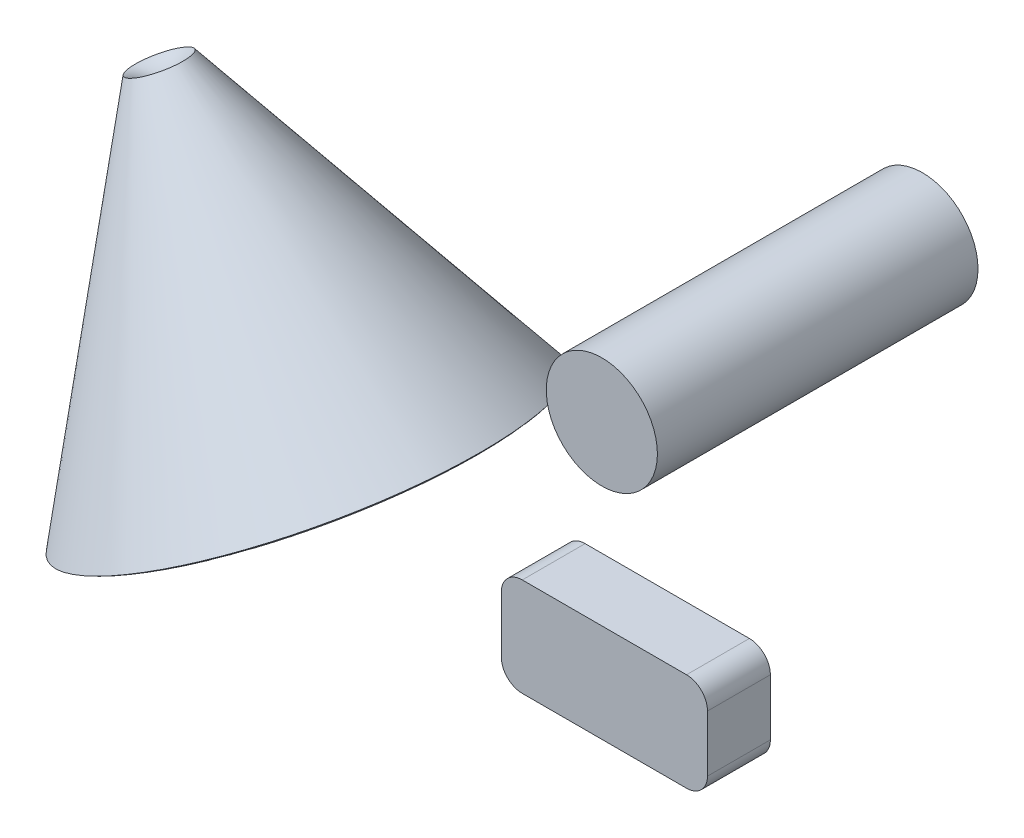
ISO-10303-21;
HEADER;
FILE_DESCRIPTION(('STEP AP214'),'2;1');
FILE_NAME('part.step','',(''),(''),'','','');
FILE_SCHEMA(('AUTOMOTIVE_DESIGN { 1 0 10303 214 1 1 1 1 }'));
ENDSEC;
DATA;
#1=APPLICATION_CONTEXT('core data for automotive mechanical design processes');
#2=APPLICATION_PROTOCOL_DEFINITION('international standard','automotive_design',2000,#1);
#3=PRODUCT_CONTEXT('',#1,'mechanical');
#4=PRODUCT('Part','Part','',(#3));
#5=PRODUCT_RELATED_PRODUCT_CATEGORY('part','',(#4));
#6=PRODUCT_DEFINITION_FORMATION('','',#4);
#7=PRODUCT_DEFINITION_CONTEXT('part definition',#1,'design');
#8=PRODUCT_DEFINITION('design','',#6,#7);
#9=PRODUCT_DEFINITION_SHAPE('','',#8);
#10=(LENGTH_UNIT() NAMED_UNIT(*) SI_UNIT(.MILLI.,.METRE.));
#11=(NAMED_UNIT(*) PLANE_ANGLE_UNIT() SI_UNIT($,.RADIAN.));
#12=(NAMED_UNIT(*) SI_UNIT($,.STERADIAN.) SOLID_ANGLE_UNIT());
#13=UNCERTAINTY_MEASURE_WITH_UNIT(LENGTH_MEASURE(1.E-05),#10,'distance_accuracy_value','');
#14=(GEOMETRIC_REPRESENTATION_CONTEXT(3) GLOBAL_UNCERTAINTY_ASSIGNED_CONTEXT((#13)) GLOBAL_UNIT_ASSIGNED_CONTEXT((#10,
#11,#12)) REPRESENTATION_CONTEXT('',''));
#15=CARTESIAN_POINT('',(0.,0.,0.));
#16=DIRECTION('',(0.,0.,1.));
#17=DIRECTION('',(1.,0.,0.));
#18=AXIS2_PLACEMENT_3D('',#15,#16,#17);
#19=CARTESIAN_POINT('',(394.330774186837,124.883495853498,30.));
#20=DIRECTION('',(0.,0.,-1.));
#21=DIRECTION('',(-1.,0.,0.));
#22=AXIS2_PLACEMENT_3D('',#19,#20,#21);
#23=CYLINDRICAL_SURFACE('',#22,10.);
#24=CARTESIAN_POINT('',(394.330774186837,124.883495853498,0.));
#25=DIRECTION('',(0.,0.,1.));
#26=DIRECTION('',(1.,0.,0.));
#27=AXIS2_PLACEMENT_3D('',#24,#25,#26);
#28=CIRCLE('',#27,10.);
#29=CARTESIAN_POINT('',(384.330774186837,124.883495853498,0.));
#30=VERTEX_POINT('',#29);
#31=CARTESIAN_POINT('',(394.330774186837,114.883495853498,0.));
#32=VERTEX_POINT('',#31);
#33=EDGE_CURVE('E145',#30,#32,#28,.T.);
#34=ORIENTED_EDGE('',*,*,#33,.T.);
#35=DIRECTION('',(0.,0.,-1.));
#36=VECTOR('',#35,1.);
#37=CARTESIAN_POINT('',(394.330774186837,114.883495853498,30.));
#38=LINE('',#37,#36);
#39=CARTESIAN_POINT('',(394.330774186837,114.883495853498,30.));
#40=VERTEX_POINT('',#39);
#41=EDGE_CURVE('E12',#40,#32,#38,.T.);
#42=ORIENTED_EDGE('',*,*,#41,.F.);
#43=CARTESIAN_POINT('',(394.330774186837,124.883495853498,30.));
#44=DIRECTION('',(0.,0.,1.));
#45=DIRECTION('',(1.,0.,0.));
#46=AXIS2_PLACEMENT_3D('',#43,#44,#45);
#47=CIRCLE('',#46,10.);
#48=CARTESIAN_POINT('',(384.330774186837,124.883495853498,30.));
#49=VERTEX_POINT('',#48);
#50=EDGE_CURVE('E158',#49,#40,#47,.T.);
#51=ORIENTED_EDGE('',*,*,#50,.F.);
#52=DIRECTION('',(0.,0.,-1.));
#53=VECTOR('',#52,1.);
#54=CARTESIAN_POINT('',(384.330774186837,124.883495853498,30.));
#55=LINE('',#54,#53);
#56=EDGE_CURVE('E136',#49,#30,#55,.T.);
#57=ORIENTED_EDGE('',*,*,#56,.T.);
#58=EDGE_LOOP('',(#34,#42,#51,#57));
#59=FACE_BOUND('',#58,.T.);
#60=ADVANCED_FACE('F48',(#59),#23,.T.);
#61=CARTESIAN_POINT('',(394.330774186837,114.883495853498,30.));
#62=DIRECTION('',(0.,1.,0.));
#63=DIRECTION('',(0.,0.,1.));
#64=AXIS2_PLACEMENT_3D('',#61,#62,#63);
#65=PLANE('',#64);
#66=DIRECTION('',(1.,0.,0.));
#67=VECTOR('',#66,1.);
#68=CARTESIAN_POINT('',(394.330774186837,114.883495853498,0.));
#69=LINE('',#68,#67);
#70=CARTESIAN_POINT('',(472.718965476247,114.883495853498,0.));
#71=VERTEX_POINT('',#70);
#72=EDGE_CURVE('E150',#32,#71,#69,.T.);
#73=ORIENTED_EDGE('',*,*,#72,.T.);
#74=DIRECTION('',(0.,0.,-1.));
#75=VECTOR('',#74,1.);
#76=CARTESIAN_POINT('',(472.718965476247,114.883495853498,30.));
#77=LINE('',#76,#75);
#78=CARTESIAN_POINT('',(472.718965476247,114.883495853498,30.));
#79=VERTEX_POINT('',#78);
#80=EDGE_CURVE('E57',#79,#71,#77,.T.);
#81=ORIENTED_EDGE('',*,*,#80,.F.);
#82=DIRECTION('',(1.,0.,0.));
#83=VECTOR('',#82,1.);
#84=CARTESIAN_POINT('',(394.330774186837,114.883495853498,30.));
#85=LINE('',#84,#83);
#86=EDGE_CURVE('E110',#40,#79,#85,.T.);
#87=ORIENTED_EDGE('',*,*,#86,.F.);
#88=ORIENTED_EDGE('',*,*,#41,.T.);
#89=EDGE_LOOP('',(#73,#81,#87,#88));
#90=FACE_BOUND('',#89,.T.);
#91=ADVANCED_FACE('F192',(#90),#65,.F.);
#92=CARTESIAN_POINT('',(472.718965476247,124.883495853498,30.));
#93=DIRECTION('',(0.,0.,-1.));
#94=DIRECTION('',(-1.,0.,0.));
#95=AXIS2_PLACEMENT_3D('',#92,#93,#94);
#96=CYLINDRICAL_SURFACE('',#95,10.);
#97=CARTESIAN_POINT('',(472.718965476247,124.883495853498,0.));
#98=DIRECTION('',(0.,0.,1.));
#99=DIRECTION('',(1.,0.,0.));
#100=AXIS2_PLACEMENT_3D('',#97,#98,#99);
#101=CIRCLE('',#100,10.);
#102=CARTESIAN_POINT('',(482.718965476247,124.883495853498,0.));
#103=VERTEX_POINT('',#102);
#104=EDGE_CURVE('E149',#71,#103,#101,.T.);
#105=ORIENTED_EDGE('',*,*,#104,.T.);
#106=DIRECTION('',(0.,0.,-1.));
#107=VECTOR('',#106,1.);
#108=CARTESIAN_POINT('',(482.718965476247,124.883495853498,30.));
#109=LINE('',#108,#107);
#110=CARTESIAN_POINT('',(482.718965476247,124.883495853498,30.));
#111=VERTEX_POINT('',#110);
#112=EDGE_CURVE('E164',#111,#103,#109,.T.);
#113=ORIENTED_EDGE('',*,*,#112,.F.);
#114=CARTESIAN_POINT('',(472.718965476247,124.883495853498,30.));
#115=DIRECTION('',(0.,0.,1.));
#116=DIRECTION('',(1.,0.,0.));
#117=AXIS2_PLACEMENT_3D('',#114,#115,#116);
#118=CIRCLE('',#117,10.);
#119=EDGE_CURVE('E174',#79,#111,#118,.T.);
#120=ORIENTED_EDGE('',*,*,#119,.F.);
#121=ORIENTED_EDGE('',*,*,#80,.T.);
#122=EDGE_LOOP('',(#105,#113,#120,#121));
#123=FACE_BOUND('',#122,.T.);
#124=ADVANCED_FACE('F172',(#123),#96,.T.);
#125=CARTESIAN_POINT('',(482.718965476247,151.789494026356,30.));
#126=DIRECTION('',(-1.,0.,0.));
#127=DIRECTION('',(0.,0.,1.));
#128=AXIS2_PLACEMENT_3D('',#125,#126,#127);
#129=PLANE('',#128);
#130=DIRECTION('',(0.,1.,0.));
#131=VECTOR('',#130,1.);
#132=CARTESIAN_POINT('',(482.718965476247,151.789494026356,0.));
#133=LINE('',#132,#131);
#134=CARTESIAN_POINT('',(482.718965476247,151.789494026356,0.));
#135=VERTEX_POINT('',#134);
#136=EDGE_CURVE('E151',#103,#135,#133,.T.);
#137=ORIENTED_EDGE('',*,*,#136,.T.);
#138=DIRECTION('',(0.,0.,-1.));
#139=VECTOR('',#138,1.);
#140=CARTESIAN_POINT('',(482.718965476247,151.789494026356,30.));
#141=LINE('',#140,#139);
#142=CARTESIAN_POINT('',(482.718965476247,151.789494026356,30.));
#143=VERTEX_POINT('',#142);
#144=EDGE_CURVE('E165',#143,#135,#141,.T.);
#145=ORIENTED_EDGE('',*,*,#144,.F.);
#146=DIRECTION('',(0.,1.,0.));
#147=VECTOR('',#146,1.);
#148=CARTESIAN_POINT('',(482.718965476247,151.789494026356,30.));
#149=LINE('',#148,#147);
#150=EDGE_CURVE('E183',#111,#143,#149,.T.);
#151=ORIENTED_EDGE('',*,*,#150,.F.);
#152=ORIENTED_EDGE('',*,*,#112,.T.);
#153=EDGE_LOOP('',(#137,#145,#151,#152));
#154=FACE_BOUND('',#153,.T.);
#155=ADVANCED_FACE('F182',(#154),#129,.F.);
#156=CARTESIAN_POINT('',(472.718965476247,151.789494026356,30.));
#157=DIRECTION('',(0.,0.,-1.));
#158=DIRECTION('',(-1.,0.,0.));
#159=AXIS2_PLACEMENT_3D('',#156,#157,#158);
#160=CYLINDRICAL_SURFACE('',#159,10.);
#161=CARTESIAN_POINT('',(472.718965476247,151.789494026356,0.));
#162=DIRECTION('',(0.,0.,1.));
#163=DIRECTION('',(-1.,0.,0.));
#164=AXIS2_PLACEMENT_3D('',#161,#162,#163);
#165=CIRCLE('',#164,10.);
#166=CARTESIAN_POINT('',(472.718965476247,161.789494026356,0.));
#167=VERTEX_POINT('',#166);
#168=EDGE_CURVE('E153',#135,#167,#165,.T.);
#169=ORIENTED_EDGE('',*,*,#168,.T.);
#170=DIRECTION('',(0.,0.,-1.));
#171=VECTOR('',#170,1.);
#172=CARTESIAN_POINT('',(472.718965476247,161.789494026356,30.));
#173=LINE('',#172,#171);
#174=CARTESIAN_POINT('',(472.718965476247,161.789494026356,30.));
#175=VERTEX_POINT('',#174);
#176=EDGE_CURVE('E133',#175,#167,#173,.T.);
#177=ORIENTED_EDGE('',*,*,#176,.F.);
#178=CARTESIAN_POINT('',(472.718965476247,151.789494026356,30.));
#179=DIRECTION('',(0.,0.,1.));
#180=DIRECTION('',(-1.,0.,0.));
#181=AXIS2_PLACEMENT_3D('',#178,#179,#180);
#182=CIRCLE('',#181,10.);
#183=EDGE_CURVE('E127',#143,#175,#182,.T.);
#184=ORIENTED_EDGE('',*,*,#183,.F.);
#185=ORIENTED_EDGE('',*,*,#144,.T.);
#186=EDGE_LOOP('',(#169,#177,#184,#185));
#187=FACE_BOUND('',#186,.T.);
#188=ADVANCED_FACE('F184',(#187),#160,.T.);
#189=CARTESIAN_POINT('',(394.330774186837,161.789494026356,30.));
#190=DIRECTION('',(0.,-1.,0.));
#191=DIRECTION('',(0.,0.,-1.));
#192=AXIS2_PLACEMENT_3D('',#189,#190,#191);
#193=PLANE('',#192);
#194=DIRECTION('',(-1.,0.,0.));
#195=VECTOR('',#194,1.);
#196=CARTESIAN_POINT('',(394.330774186837,161.789494026356,0.));
#197=LINE('',#196,#195);
#198=CARTESIAN_POINT('',(394.330774186837,161.789494026356,0.));
#199=VERTEX_POINT('',#198);
#200=EDGE_CURVE('E131',#167,#199,#197,.T.);
#201=ORIENTED_EDGE('',*,*,#200,.T.);
#202=DIRECTION('',(0.,0.,-1.));
#203=VECTOR('',#202,1.);
#204=CARTESIAN_POINT('',(394.330774186837,161.789494026356,30.));
#205=LINE('',#204,#203);
#206=CARTESIAN_POINT('',(394.330774186837,161.789494026356,30.));
#207=VERTEX_POINT('',#206);
#208=EDGE_CURVE('E132',#207,#199,#205,.T.);
#209=ORIENTED_EDGE('',*,*,#208,.F.);
#210=DIRECTION('',(-1.,0.,0.));
#211=VECTOR('',#210,1.);
#212=CARTESIAN_POINT('',(394.330774186837,161.789494026356,30.));
#213=LINE('',#212,#211);
#214=EDGE_CURVE('E118',#175,#207,#213,.T.);
#215=ORIENTED_EDGE('',*,*,#214,.F.);
#216=ORIENTED_EDGE('',*,*,#176,.T.);
#217=EDGE_LOOP('',(#201,#209,#215,#216));
#218=FACE_BOUND('',#217,.T.);
#219=ADVANCED_FACE('F135',(#218),#193,.F.);
#220=CARTESIAN_POINT('',(394.330774186837,151.789494026356,30.));
#221=DIRECTION('',(0.,0.,-1.));
#222=DIRECTION('',(-1.,0.,0.));
#223=AXIS2_PLACEMENT_3D('',#220,#221,#222);
#224=CYLINDRICAL_SURFACE('',#223,10.);
#225=CARTESIAN_POINT('',(394.330774186837,151.789494026356,0.));
#226=DIRECTION('',(0.,0.,1.));
#227=DIRECTION('',(1.,0.,0.));
#228=AXIS2_PLACEMENT_3D('',#225,#226,#227);
#229=CIRCLE('',#228,10.);
#230=CARTESIAN_POINT('',(384.330774186837,151.789494026356,0.));
#231=VERTEX_POINT('',#230);
#232=EDGE_CURVE('E91',#199,#231,#229,.T.);
#233=ORIENTED_EDGE('',*,*,#232,.T.);
#234=DIRECTION('',(0.,0.,-1.));
#235=VECTOR('',#234,1.);
#236=CARTESIAN_POINT('',(384.330774186837,151.789494026356,30.));
#237=LINE('',#236,#235);
#238=CARTESIAN_POINT('',(384.330774186837,151.789494026356,30.));
#239=VERTEX_POINT('',#238);
#240=EDGE_CURVE('E138',#239,#231,#237,.T.);
#241=ORIENTED_EDGE('',*,*,#240,.F.);
#242=CARTESIAN_POINT('',(394.330774186837,151.789494026356,30.));
#243=DIRECTION('',(0.,0.,1.));
#244=DIRECTION('',(1.,0.,0.));
#245=AXIS2_PLACEMENT_3D('',#242,#243,#244);
#246=CIRCLE('',#245,10.);
#247=EDGE_CURVE('E125',#207,#239,#246,.T.);
#248=ORIENTED_EDGE('',*,*,#247,.F.);
#249=ORIENTED_EDGE('',*,*,#208,.T.);
#250=EDGE_LOOP('',(#233,#241,#248,#249));
#251=FACE_BOUND('',#250,.T.);
#252=ADVANCED_FACE('F137',(#251),#224,.T.);
#253=CARTESIAN_POINT('',(384.330774186837,151.789494026356,30.));
#254=DIRECTION('',(1.,0.,0.));
#255=DIRECTION('',(0.,0.,-1.));
#256=AXIS2_PLACEMENT_3D('',#253,#254,#255);
#257=PLANE('',#256);
#258=DIRECTION('',(0.,-1.,0.));
#259=VECTOR('',#258,1.);
#260=CARTESIAN_POINT('',(384.330774186837,151.789494026356,0.));
#261=LINE('',#260,#259);
#262=EDGE_CURVE('E97',#231,#30,#261,.T.);
#263=ORIENTED_EDGE('',*,*,#262,.T.);
#264=ORIENTED_EDGE('',*,*,#56,.F.);
#265=DIRECTION('',(0.,-1.,0.));
#266=VECTOR('',#265,1.);
#267=CARTESIAN_POINT('',(384.330774186837,151.789494026356,30.));
#268=LINE('',#267,#266);
#269=EDGE_CURVE('E61',#239,#49,#268,.T.);
#270=ORIENTED_EDGE('',*,*,#269,.F.);
#271=ORIENTED_EDGE('',*,*,#240,.T.);
#272=EDGE_LOOP('',(#263,#264,#270,#271));
#273=FACE_BOUND('',#272,.T.);
#274=ADVANCED_FACE('F207',(#273),#257,.F.);
#275=CARTESIAN_POINT('',(394.330774186837,124.883495853498,30.));
#276=DIRECTION('',(0.,0.,1.));
#277=DIRECTION('',(1.,0.,0.));
#278=AXIS2_PLACEMENT_3D('',#275,#276,#277);
#279=PLANE('',#278);
#280=ORIENTED_EDGE('',*,*,#50,.T.);
#281=ORIENTED_EDGE('',*,*,#86,.T.);
#282=ORIENTED_EDGE('',*,*,#119,.T.);
#283=ORIENTED_EDGE('',*,*,#150,.T.);
#284=ORIENTED_EDGE('',*,*,#183,.T.);
#285=ORIENTED_EDGE('',*,*,#214,.T.);
#286=ORIENTED_EDGE('',*,*,#247,.T.);
#287=ORIENTED_EDGE('',*,*,#269,.T.);
#288=EDGE_LOOP('',(#280,#281,#282,#283,#284,#285,#286,#287));
#289=FACE_BOUND('',#288,.T.);
#290=ADVANCED_FACE('F124',(#289),#279,.T.);
#291=CARTESIAN_POINT('',(394.330774186837,124.883495853498,0.));
#292=DIRECTION('',(0.,0.,1.));
#293=DIRECTION('',(1.,0.,0.));
#294=AXIS2_PLACEMENT_3D('',#291,#292,#293);
#295=PLANE('',#294);
#296=ORIENTED_EDGE('',*,*,#33,.F.);
#297=ORIENTED_EDGE('',*,*,#262,.F.);
#298=ORIENTED_EDGE('',*,*,#232,.F.);
#299=ORIENTED_EDGE('',*,*,#200,.F.);
#300=ORIENTED_EDGE('',*,*,#168,.F.);
#301=ORIENTED_EDGE('',*,*,#136,.F.);
#302=ORIENTED_EDGE('',*,*,#104,.F.);
#303=ORIENTED_EDGE('',*,*,#72,.F.);
#304=EDGE_LOOP('',(#296,#297,#298,#299,#300,#301,#302,#303));
#305=FACE_BOUND('',#304,.T.);
#306=ADVANCED_FACE('F179',(#305),#295,.F.);
#307=CLOSED_SHELL('',(#60,#91,#124,#155,#188,#219,#252,#274,#290,#306));
#308=MANIFOLD_SOLID_BREP('B2',#307);
#309=CARTESIAN_POINT('',(402.293944257349,216.076736945074,-153.));
#310=DIRECTION('',(0.,0.,1.));
#311=DIRECTION('',(1.,0.,0.));
#312=AXIS2_PLACEMENT_3D('',#309,#310,#311);
#313=CYLINDRICAL_SURFACE('',#312,26.5215877527951);
#314=CARTESIAN_POINT('',(402.293944257349,216.076736945074,-153.));
#315=DIRECTION('',(0.,0.,1.));
#316=DIRECTION('',(1.,0.,0.));
#317=AXIS2_PLACEMENT_3D('',#314,#315,#316);
#318=CIRCLE('',#317,26.5215877527951);
#319=CARTESIAN_POINT('',(428.815532010144,216.076736945074,-153.));
#320=VERTEX_POINT('',#319);
#321=EDGE_CURVE('E50',#320,#320,#318,.T.);
#322=ORIENTED_EDGE('',*,*,#321,.T.);
#323=EDGE_LOOP('',(#322));
#324=FACE_BOUND('',#323,.T.);
#325=CARTESIAN_POINT('',(402.293944257349,216.076736945074,0.));
#326=DIRECTION('',(0.,0.,1.));
#327=DIRECTION('',(1.,0.,0.));
#328=AXIS2_PLACEMENT_3D('',#325,#326,#327);
#329=CIRCLE('',#328,26.5215877527951);
#330=CARTESIAN_POINT('',(428.815532010144,216.076736945074,0.));
#331=VERTEX_POINT('',#330);
#332=EDGE_CURVE('E288',#331,#331,#329,.T.);
#333=ORIENTED_EDGE('',*,*,#332,.F.);
#334=EDGE_LOOP('',(#333));
#335=FACE_BOUND('',#334,.T.);
#336=ADVANCED_FACE('F284',(#324,#335),#313,.T.);
#337=CARTESIAN_POINT('',(402.293944257349,216.076736945074,-153.));
#338=DIRECTION('',(0.,0.,1.));
#339=DIRECTION('',(1.,0.,0.));
#340=AXIS2_PLACEMENT_3D('',#337,#338,#339);
#341=PLANE('',#340);
#342=ORIENTED_EDGE('',*,*,#321,.F.);
#343=EDGE_LOOP('',(#342));
#344=FACE_BOUND('',#343,.T.);
#345=ADVANCED_FACE('F299',(#344),#341,.F.);
#346=CARTESIAN_POINT('',(402.293944257349,216.076736945074,0.));
#347=DIRECTION('',(0.,0.,1.));
#348=DIRECTION('',(1.,0.,0.));
#349=AXIS2_PLACEMENT_3D('',#346,#347,#348);
#350=PLANE('',#349);
#351=ORIENTED_EDGE('',*,*,#332,.T.);
#352=EDGE_LOOP('',(#351));
#353=FACE_BOUND('',#352,.T.);
#354=ADVANCED_FACE('F293',(#353),#350,.T.);
#355=CLOSED_SHELL('',(#336,#345,#354));
#356=MANIFOLD_SOLID_BREP('B6',#355);
#357=CARTESIAN_POINT('',(264.496914103669,125.275632471208,0.));
#358=DIRECTION('',(0.481714513418346,-0.876328207672289,0.));
#359=DIRECTION('',(0.876328207672289,0.481714513418346,0.));
#360=AXIS2_PLACEMENT_3D('',#357,#358,#359);
#361=CONICAL_SURFACE('',#360,85.3763693949128,0.502610136791832);
#362=CARTESIAN_POINT('',(197.566855391867,247.033845596452,0.));
#363=DIRECTION('',(0.481714513418346,-0.876328207672289,0.));
#364=DIRECTION('',(0.876328207672289,0.481714513418346,0.));
#365=AXIS2_PLACEMENT_3D('',#362,#363,#364);
#366=CIRCLE('',#365,9.00080813164819);
#367=CARTESIAN_POINT('',(205.454517449476,251.369665505961,0.));
#368=VERTEX_POINT('',#367);
#369=EDGE_CURVE('E285',#368,#368,#366,.F.);
#370=CARTESIAN_POINT('',(260.275513942133,132.955143746829,0.));
#371=DIRECTION('',(0.481714513418346,-0.876328207672289,0.));
#372=DIRECTION('',(0.876328207672289,0.481714513418346,0.));
#373=AXIS2_PLACEMENT_3D('',#370,#371,#372);
#374=CIRCLE('',#373,80.5592242607294);
#375=CARTESIAN_POINT('',(330.871834550008,171.761691262946,0.));
#376=VERTEX_POINT('',#375);
#377=EDGE_CURVE('E332',#376,#376,#374,.T.);
#378=CARTESIAN_POINT('',(205.454517449476,251.369665505961,0.));
#379=CARTESIAN_POINT('',(206.76094783594,250.540415774263,0.));
#380=CARTESIAN_POINT('',(208.067378222404,249.711166042565,0.));
#381=CARTESIAN_POINT('',(210.680238995332,248.052666579168,0.));
#382=CARTESIAN_POINT('',(211.986669381796,247.22341684747,0.));
#383=CARTESIAN_POINT('',(214.599530154724,245.564917384074,0.));
#384=CARTESIAN_POINT('',(215.905960541187,244.735667652376,0.));
#385=CARTESIAN_POINT('',(218.518821314115,243.07716818898,0.));
#386=CARTESIAN_POINT('',(219.825251700579,242.247918457282,0.));
#387=CARTESIAN_POINT('',(222.438112473507,240.589418993886,0.));
#388=CARTESIAN_POINT('',(223.744542859971,239.760169262188,0.));
#389=CARTESIAN_POINT('',(226.357403632898,238.101669798792,0.));
#390=CARTESIAN_POINT('',(227.663834019362,237.272420067093,0.));
#391=CARTESIAN_POINT('',(230.27669479229,235.613920603697,0.));
#392=CARTESIAN_POINT('',(231.583125178754,234.784670871999,0.));
#393=CARTESIAN_POINT('',(234.195985951682,233.126171408603,0.));
#394=CARTESIAN_POINT('',(235.502416338145,232.296921676905,0.));
#395=CARTESIAN_POINT('',(238.115277111073,230.638422213509,0.));
#396=CARTESIAN_POINT('',(239.421707497537,229.809172481811,0.));
#397=CARTESIAN_POINT('',(242.034568270465,228.150673018415,0.));
#398=CARTESIAN_POINT('',(243.340998656929,227.321423286717,0.));
#399=CARTESIAN_POINT('',(245.953859429856,225.66292382332,0.));
#400=CARTESIAN_POINT('',(247.26028981632,224.833674091622,0.));
#401=CARTESIAN_POINT('',(249.873150589248,223.175174628226,0.));
#402=CARTESIAN_POINT('',(251.179580975712,222.345924896528,0.));
#403=CARTESIAN_POINT('',(253.79244174864,220.687425433132,0.));
#404=CARTESIAN_POINT('',(255.098872135103,219.858175701434,0.));
#405=CARTESIAN_POINT('',(257.711732908031,218.199676238038,0.));
#406=CARTESIAN_POINT('',(259.018163294495,217.37042650634,0.));
#407=CARTESIAN_POINT('',(261.631024067423,215.711927042944,0.));
#408=CARTESIAN_POINT('',(262.937454453887,214.882677311245,0.));
#409=CARTESIAN_POINT('',(265.550315226814,213.224177847849,0.));
#410=CARTESIAN_POINT('',(266.856745613278,212.394928116151,0.));
#411=CARTESIAN_POINT('',(269.469606386206,210.736428652755,0.));
#412=CARTESIAN_POINT('',(270.77603677267,209.907178921057,0.));
#413=CARTESIAN_POINT('',(273.388897545598,208.248679457661,0.));
#414=CARTESIAN_POINT('',(274.695327932061,207.419429725963,0.));
#415=CARTESIAN_POINT('',(277.308188704989,205.760930262567,0.));
#416=CARTESIAN_POINT('',(278.614619091453,204.931680530869,0.));
#417=CARTESIAN_POINT('',(281.227479864381,203.273181067472,0.));
#418=CARTESIAN_POINT('',(282.533910250845,202.443931335774,0.));
#419=CARTESIAN_POINT('',(285.146771023772,200.785431872378,0.));
#420=CARTESIAN_POINT('',(286.453201410236,199.95618214068,0.));
#421=CARTESIAN_POINT('',(289.066062183164,198.297682677284,0.));
#422=CARTESIAN_POINT('',(290.372492569628,197.468432945586,0.));
#423=CARTESIAN_POINT('',(292.985353342556,195.80993348219,0.));
#424=CARTESIAN_POINT('',(294.291783729019,194.980683750492,0.));
#425=CARTESIAN_POINT('',(296.904644501947,193.322184287095,0.));
#426=CARTESIAN_POINT('',(298.211074888411,192.492934555397,0.));
#427=CARTESIAN_POINT('',(300.823935661339,190.834435092001,0.));
#428=CARTESIAN_POINT('',(302.130366047803,190.005185360303,0.));
#429=CARTESIAN_POINT('',(304.74322682073,188.346685896907,0.));
#430=CARTESIAN_POINT('',(306.049657207194,187.517436165209,0.));
#431=CARTESIAN_POINT('',(308.662517980122,185.858936701813,0.));
#432=CARTESIAN_POINT('',(309.968948366586,185.029686970115,0.));
#433=CARTESIAN_POINT('',(312.581809139513,183.371187506719,0.));
#434=CARTESIAN_POINT('',(313.888239525977,182.54193777502,0.));
#435=CARTESIAN_POINT('',(316.501100298905,180.883438311624,0.));
#436=CARTESIAN_POINT('',(317.807530685369,180.054188579926,0.));
#437=CARTESIAN_POINT('',(320.420391458297,178.39568911653,0.));
#438=CARTESIAN_POINT('',(321.726821844761,177.566439384832,0.));
#439=CARTESIAN_POINT('',(324.339682617688,175.907939921436,0.));
#440=CARTESIAN_POINT('',(325.646113004152,175.078690189738,0.));
#441=CARTESIAN_POINT('',(328.25897377708,173.420190726342,0.));
#442=CARTESIAN_POINT('',(329.565404163544,172.590940994644,0.));
#443=CARTESIAN_POINT('',(330.871834550008,171.761691262946,0.));
#444=B_SPLINE_CURVE_WITH_KNOTS('',3,(#378,#379,#380,#381,#382,#383,#384,#385,#386,#387,#388,
#389,#390,#391,#392,#393,#394,#395,#396,#397,#398,#399,#400,#401,#402,#403,#404,#405,#406,#407,
#408,#409,#410,#411,#412,#413,#414,#415,#416,#417,#418,#419,#420,#421,#422,#423,#424,#425,#426,
#427,#428,#429,#430,#431,#432,#433,#434,#435,#436,#437,#438,#439,#440,#441,#442,#443),
.UNSPECIFIED.,.F.,.F.,(4,2,2,2,2,2,2,2,2,2,2,2,2,2,2,2,2,2,2,2,2,2,2,2,2,2,2,2,2,2,2,2,4),(0.,
4.64216967050724,9.28433934101445,13.9265090115217,18.5686786820289,23.2108483525361,
27.8530180230433,32.4951876935506,37.1373573640578,41.779527034565,46.4216967050722,
51.0638663755794,55.7060360460867,60.3482057165939,64.9903753871011,69.6325450576083,
74.2747147281155,78.9168843986227,83.55905406913,88.2012237396372,92.8433934101444,
97.4855630806516,102.127732751159,106.769902421666,111.412072092173,116.054241762681,
120.696411433188,125.338581103695,129.980750774202,134.622920444709,139.265090115217,
143.907259785724,148.549429456231),.UNSPECIFIED.);
#445=EDGE_CURVE('BSEAM322',#368,#376,#444,.T.);
#446=ORIENTED_EDGE('',*,*,#369,.T.);
#447=ORIENTED_EDGE('',*,*,#377,.T.);
#448=ORIENTED_EDGE('',*,*,#445,.T.);
#449=ORIENTED_EDGE('',*,*,#445,.F.);
#450=EDGE_LOOP('',(#446,#448,#447,#449));
#451=FACE_BOUND('',#450,.T.);
#452=ADVANCED_FACE('F322',(#451),#361,.F.);
#453=CARTESIAN_POINT('',(262.17642537929,129.497032632744,0.));
#454=DIRECTION('',(0.481714513418346,-0.876328207672289,0.));
#455=DIRECTION('',(0.876328207672289,0.481714513418346,0.));
#456=AXIS2_PLACEMENT_3D('',#453,#454,#455);
#457=CONICAL_SURFACE('',#456,94.1396514716357,0.502610136791832);
#458=CARTESIAN_POINT('',(191.024966505952,258.934757033609,0.));
#459=DIRECTION('',(-0.481714513418346,0.876328207672289,0.));
#460=DIRECTION('',(-0.876328207672289,-0.481714513418346,0.));
#461=AXIS2_PLACEMENT_3D('',#458,#459,#460);
#462=CIRCLE('',#461,12.9469450741876);
#463=CARTESIAN_POINT('',(202.370739677647,265.171488380276,0.));
#464=VERTEX_POINT('',#463);
#465=EDGE_CURVE('E336',#464,#464,#462,.T.);
#466=CARTESIAN_POINT('',(262.17642537929,129.497032632744,0.));
#467=DIRECTION('',(-0.481714513418346,0.876328207672289,0.));
#468=DIRECTION('',(-0.876328207672289,-0.481714513418346,0.));
#469=AXIS2_PLACEMENT_3D('',#466,#467,#468);
#470=CIRCLE('',#469,94.1396514716357);
#471=CARTESIAN_POINT('',(344.673657424323,174.845469034776,0.));
#472=VERTEX_POINT('',#471);
#473=EDGE_CURVE('E333',#472,#472,#470,.T.);
#474=CARTESIAN_POINT('',(202.370739677647,265.171488380276,0.));
#475=CARTESIAN_POINT('',(203.853061737508,264.230592345427,0.));
#476=CARTESIAN_POINT('',(205.335383797369,263.289696310578,0.));
#477=CARTESIAN_POINT('',(208.300027917091,261.40790424088,0.));
#478=CARTESIAN_POINT('',(209.782349976953,260.467008206031,0.));
#479=CARTESIAN_POINT('',(212.746994096675,258.585216136333,0.));
#480=CARTESIAN_POINT('',(214.229316156536,257.644320101484,0.));
#481=CARTESIAN_POINT('',(217.193960276259,255.762528031786,0.));
#482=CARTESIAN_POINT('',(218.67628233612,254.821631996937,0.));
#483=CARTESIAN_POINT('',(221.640926455842,252.939839927239,0.));
#484=CARTESIAN_POINT('',(223.123248515704,251.99894389239,0.));
#485=CARTESIAN_POINT('',(226.087892635426,250.117151822692,0.));
#486=CARTESIAN_POINT('',(227.570214695287,249.176255787843,0.));
#487=CARTESIAN_POINT('',(230.53485881501,247.294463718146,0.));
#488=CARTESIAN_POINT('',(232.017180874871,246.353567683297,0.));
#489=CARTESIAN_POINT('',(234.981824994593,244.471775613599,0.));
#490=CARTESIAN_POINT('',(236.464147054454,243.53087957875,0.));
#491=CARTESIAN_POINT('',(239.428791174177,241.649087509052,0.));
#492=CARTESIAN_POINT('',(240.911113234038,240.708191474203,0.));
#493=CARTESIAN_POINT('',(243.87575735376,238.826399404505,0.));
#494=CARTESIAN_POINT('',(245.358079413622,237.885503369656,0.));
#495=CARTESIAN_POINT('',(248.322723533344,236.003711299958,0.));
#496=CARTESIAN_POINT('',(249.805045593205,235.062815265109,0.));
#497=CARTESIAN_POINT('',(252.769689712928,233.181023195411,0.));
#498=CARTESIAN_POINT('',(254.252011772789,232.240127160562,0.));
#499=CARTESIAN_POINT('',(257.216655892511,230.358335090864,0.));
#500=CARTESIAN_POINT('',(258.698977952373,229.417439056015,0.));
#501=CARTESIAN_POINT('',(261.663622072095,227.535646986317,0.));
#502=CARTESIAN_POINT('',(263.145944131956,226.594750951468,0.));
#503=CARTESIAN_POINT('',(266.110588251679,224.71295888177,0.));
#504=CARTESIAN_POINT('',(267.59291031154,223.772062846922,0.));
#505=CARTESIAN_POINT('',(270.557554431262,221.890270777224,0.));
#506=CARTESIAN_POINT('',(272.039876491123,220.949374742375,0.));
#507=CARTESIAN_POINT('',(275.004520610846,219.067582672677,0.));
#508=CARTESIAN_POINT('',(276.486842670707,218.126686637828,0.));
#509=CARTESIAN_POINT('',(279.451486790429,216.24489456813,0.));
#510=CARTESIAN_POINT('',(280.933808850291,215.303998533281,0.));
#511=CARTESIAN_POINT('',(283.898452970013,213.422206463583,0.));
#512=CARTESIAN_POINT('',(285.380775029874,212.481310428734,0.));
#513=CARTESIAN_POINT('',(288.345419149597,210.599518359036,0.));
#514=CARTESIAN_POINT('',(289.827741209458,209.658622324187,0.));
#515=CARTESIAN_POINT('',(292.79238532918,207.776830254489,0.));
#516=CARTESIAN_POINT('',(294.274707389042,206.83593421964,0.));
#517=CARTESIAN_POINT('',(297.239351508764,204.954142149942,0.));
#518=CARTESIAN_POINT('',(298.721673568625,204.013246115093,0.));
#519=CARTESIAN_POINT('',(301.686317688348,202.131454045395,0.));
#520=CARTESIAN_POINT('',(303.168639748209,201.190558010546,0.));
#521=CARTESIAN_POINT('',(306.133283867931,199.308765940849,0.));
#522=CARTESIAN_POINT('',(307.615605927792,198.367869906,0.));
#523=CARTESIAN_POINT('',(310.580250047515,196.486077836302,0.));
#524=CARTESIAN_POINT('',(312.062572107376,195.545181801453,0.));
#525=CARTESIAN_POINT('',(315.027216227099,193.663389731755,0.));
#526=CARTESIAN_POINT('',(316.50953828696,192.722493696906,0.));
#527=CARTESIAN_POINT('',(319.474182406682,190.840701627208,0.));
#528=CARTESIAN_POINT('',(320.956504466543,189.899805592359,0.));
#529=CARTESIAN_POINT('',(323.921148586266,188.018013522661,0.));
#530=CARTESIAN_POINT('',(325.403470646127,187.077117487812,0.));
#531=CARTESIAN_POINT('',(328.368114765849,185.195325418114,0.));
#532=CARTESIAN_POINT('',(329.850436825711,184.254429383265,0.));
#533=CARTESIAN_POINT('',(332.815080945433,182.372637313567,0.));
#534=CARTESIAN_POINT('',(334.297403005294,181.431741278718,0.));
#535=CARTESIAN_POINT('',(337.262047125017,179.54994920902,0.));
#536=CARTESIAN_POINT('',(338.744369184878,178.609053174171,0.));
#537=CARTESIAN_POINT('',(341.7090133046,176.727261104473,0.));
#538=CARTESIAN_POINT('',(343.191335364462,175.786365069624,0.));
#539=CARTESIAN_POINT('',(344.673657424323,174.845469034776,0.));
#540=B_SPLINE_CURVE_WITH_KNOTS('',3,(#474,#475,#476,#477,#478,#479,#480,#481,#482,#483,#484,
#485,#486,#487,#488,#489,#490,#491,#492,#493,#494,#495,#496,#497,#498,#499,#500,#501,#502,#503,
#504,#505,#506,#507,#508,#509,#510,#511,#512,#513,#514,#515,#516,#517,#518,#519,#520,#521,#522,
#523,#524,#525,#526,#527,#528,#529,#530,#531,#532,#533,#534,#535,#536,#537,#538,#539),
.UNSPECIFIED.,.F.,.F.,(4,2,2,2,2,2,2,2,2,2,2,2,2,2,2,2,2,2,2,2,2,2,2,2,2,2,2,2,2,2,2,2,4),(0.,
5.26716967050721,10.5343393410145,15.8015090115217,21.0686786820289,26.3358483525361,
31.6030180230433,36.8701876935506,42.1373573640578,47.404527034565,52.6716967050722,
57.9388663755794,63.2060360460866,68.4732057165938,73.740375387101,79.0075450576082,
84.2747147281154,89.5418843986227,94.8090540691299,100.076223739637,105.343393410144,
110.610563080652,115.877732751159,121.144902421666,126.412072092173,131.67924176268,
136.946411433188,142.213581103695,147.480750774202,152.747920444709,158.015090115216,
163.282259785724,168.549429456231),.UNSPECIFIED.);
#541=EDGE_CURVE('BSEAM346',#464,#472,#540,.T.);
#542=ORIENTED_EDGE('',*,*,#465,.F.);
#543=ORIENTED_EDGE('',*,*,#473,.T.);
#544=ORIENTED_EDGE('',*,*,#541,.T.);
#545=ORIENTED_EDGE('',*,*,#541,.F.);
#546=EDGE_LOOP('',(#542,#544,#543,#545));
#547=FACE_BOUND('',#546,.T.);
#548=ADVANCED_FACE('F346',(#547),#457,.T.);
#549=CARTESIAN_POINT('',(195.246366667488,251.255245757988,0.));
#550=DIRECTION('',(0.481714513418346,-0.876328207672289,0.));
#551=DIRECTION('',(0.876328207672289,0.481714513418346,0.));
#552=AXIS2_PLACEMENT_3D('',#549,#550,#551);
#553=TOROIDAL_SURFACE('',#552,17.764090208371,10.);
#554=ORIENTED_EDGE('',*,*,#465,.T.);
#555=EDGE_LOOP('',(#554));
#556=FACE_BOUND('',#555,.T.);
#557=ORIENTED_EDGE('',*,*,#369,.F.);
#558=EDGE_LOOP('',(#557));
#559=FACE_BOUND('',#558,.T.);
#560=ADVANCED_FACE('F341',(#556,#559),#553,.T.);
#561=CARTESIAN_POINT('',(257.955025217754,137.176543908365,0.));
#562=DIRECTION('',(0.481714513418346,-0.876328207672289,0.));
#563=DIRECTION('',(0.876328207672289,0.481714513418346,0.));
#564=AXIS2_PLACEMENT_3D('',#561,#562,#563);
#565=TOROIDAL_SURFACE('',#564,89.3225063374522,10.);
#566=ORIENTED_EDGE('',*,*,#377,.F.);
#567=EDGE_LOOP('',(#566));
#568=FACE_BOUND('',#567,.T.);
#569=ORIENTED_EDGE('',*,*,#473,.F.);
#570=EDGE_LOOP('',(#569));
#571=FACE_BOUND('',#570,.T.);
#572=ADVANCED_FACE('F326',(#568,#571),#565,.T.);
#573=CLOSED_SHELL('',(#452,#548,#560,#572));
#574=MANIFOLD_SOLID_BREP('B45',#573);
#575=ADVANCED_BREP_SHAPE_REPRESENTATION('',(#18,#308,#356,#574),#14);
#576=SHAPE_DEFINITION_REPRESENTATION(#9,#575);
ENDSEC;
END-ISO-10303-21;
